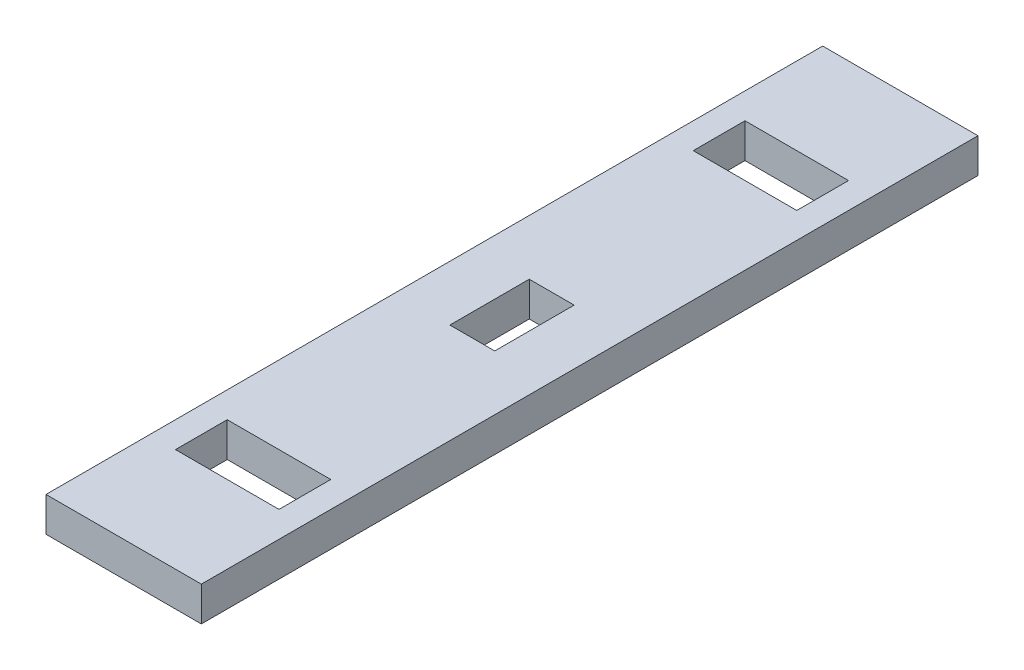
ISO-10303-21;
HEADER;
FILE_DESCRIPTION(('STEP AP214'),'2;1');
FILE_NAME('part.step','',(''),(''),'','','');
FILE_SCHEMA(('AUTOMOTIVE_DESIGN { 1 0 10303 214 1 1 1 1 }'));
ENDSEC;
DATA;
#1=APPLICATION_CONTEXT('core data for automotive mechanical design processes');
#2=APPLICATION_PROTOCOL_DEFINITION('international standard','automotive_design',2000,#1);
#3=PRODUCT_CONTEXT('',#1,'mechanical');
#4=PRODUCT('Part','Part','',(#3));
#5=PRODUCT_RELATED_PRODUCT_CATEGORY('part','',(#4));
#6=PRODUCT_DEFINITION_FORMATION('','',#4);
#7=PRODUCT_DEFINITION_CONTEXT('part definition',#1,'design');
#8=PRODUCT_DEFINITION('design','',#6,#7);
#9=PRODUCT_DEFINITION_SHAPE('','',#8);
#10=(LENGTH_UNIT() NAMED_UNIT(*) SI_UNIT(.MILLI.,.METRE.));
#11=(NAMED_UNIT(*) PLANE_ANGLE_UNIT() SI_UNIT($,.RADIAN.));
#12=(NAMED_UNIT(*) SI_UNIT($,.STERADIAN.) SOLID_ANGLE_UNIT());
#13=UNCERTAINTY_MEASURE_WITH_UNIT(LENGTH_MEASURE(1.E-05),#10,'distance_accuracy_value','');
#14=(GEOMETRIC_REPRESENTATION_CONTEXT(3) GLOBAL_UNCERTAINTY_ASSIGNED_CONTEXT((#13)) GLOBAL_UNIT_ASSIGNED_CONTEXT((#10,
#11,#12)) REPRESENTATION_CONTEXT('',''));
#15=CARTESIAN_POINT('',(0.,0.,0.));
#16=DIRECTION('',(0.,0.,1.));
#17=DIRECTION('',(1.,0.,0.));
#18=AXIS2_PLACEMENT_3D('',#15,#16,#17);
#19=CARTESIAN_POINT('',(7.90898213590071,2.,0.));
#20=DIRECTION('',(1.,0.,0.));
#21=DIRECTION('',(0.,0.,-1.));
#22=AXIS2_PLACEMENT_3D('',#19,#20,#21);
#23=PLANE('',#22);
#24=DIRECTION('',(0.,0.,1.));
#25=VECTOR('',#24,1.);
#26=CARTESIAN_POINT('',(7.90898213590071,0.,0.));
#27=LINE('',#26,#25);
#28=CARTESIAN_POINT('',(7.90898213590072,0.,-43.1225165562914));
#29=VERTEX_POINT('',#28);
#30=CARTESIAN_POINT('',(7.90898213590071,0.,1.87748344370861));
#31=VERTEX_POINT('',#30);
#32=EDGE_CURVE('E241',#29,#31,#27,.T.);
#33=ORIENTED_EDGE('',*,*,#32,.F.);
#34=DIRECTION('',(0.,-1.,0.));
#35=VECTOR('',#34,1.);
#36=CARTESIAN_POINT('',(7.90898213590072,2.,-43.1225165562914));
#37=LINE('',#36,#35);
#38=CARTESIAN_POINT('',(7.90898213590072,2.,-43.1225165562914));
#39=VERTEX_POINT('',#38);
#40=EDGE_CURVE('E260',#39,#29,#37,.T.);
#41=ORIENTED_EDGE('',*,*,#40,.F.);
#42=DIRECTION('',(0.,0.,1.));
#43=VECTOR('',#42,1.);
#44=CARTESIAN_POINT('',(7.90898213590071,2.,0.));
#45=LINE('',#44,#43);
#46=CARTESIAN_POINT('',(7.90898213590071,2.,1.87748344370861));
#47=VERTEX_POINT('',#46);
#48=EDGE_CURVE('E207',#39,#47,#45,.T.);
#49=ORIENTED_EDGE('',*,*,#48,.T.);
#50=DIRECTION('',(0.,-1.,0.));
#51=VECTOR('',#50,1.);
#52=CARTESIAN_POINT('',(7.90898213590071,2.,1.87748344370861));
#53=LINE('',#52,#51);
#54=EDGE_CURVE('E252',#47,#31,#53,.T.);
#55=ORIENTED_EDGE('',*,*,#54,.T.);
#56=EDGE_LOOP('',(#33,#41,#49,#55));
#57=FACE_BOUND('',#56,.T.);
#58=ADVANCED_FACE('F44',(#57),#23,.T.);
#59=CARTESIAN_POINT('',(0.,2.,-43.1225165562914));
#60=DIRECTION('',(0.,0.,-1.));
#61=DIRECTION('',(-1.,0.,0.));
#62=AXIS2_PLACEMENT_3D('',#59,#60,#61);
#63=PLANE('',#62);
#64=DIRECTION('',(1.,0.,0.));
#65=VECTOR('',#64,1.);
#66=CARTESIAN_POINT('',(0.,0.,-43.1225165562914));
#67=LINE('',#66,#65);
#68=CARTESIAN_POINT('',(-1.09101786409928,0.,-43.1225165562914));
#69=VERTEX_POINT('',#68);
#70=EDGE_CURVE('E244',#69,#29,#67,.T.);
#71=ORIENTED_EDGE('',*,*,#70,.F.);
#72=DIRECTION('',(0.,-1.,0.));
#73=VECTOR('',#72,1.);
#74=CARTESIAN_POINT('',(-1.09101786409928,2.,-43.1225165562914));
#75=LINE('',#74,#73);
#76=CARTESIAN_POINT('',(-1.09101786409928,2.,-43.1225165562914));
#77=VERTEX_POINT('',#76);
#78=EDGE_CURVE('E258',#77,#69,#75,.T.);
#79=ORIENTED_EDGE('',*,*,#78,.F.);
#80=DIRECTION('',(1.,0.,0.));
#81=VECTOR('',#80,1.);
#82=CARTESIAN_POINT('',(0.,2.,-43.1225165562914));
#83=LINE('',#82,#81);
#84=EDGE_CURVE('E210',#77,#39,#83,.T.);
#85=ORIENTED_EDGE('',*,*,#84,.T.);
#86=ORIENTED_EDGE('',*,*,#40,.T.);
#87=EDGE_LOOP('',(#71,#79,#85,#86));
#88=FACE_BOUND('',#87,.T.);
#89=ADVANCED_FACE('F296',(#88),#63,.T.);
#90=CARTESIAN_POINT('',(-1.09101786409928,2.,0.));
#91=DIRECTION('',(1.,0.,0.));
#92=DIRECTION('',(0.,0.,-1.));
#93=AXIS2_PLACEMENT_3D('',#90,#91,#92);
#94=PLANE('',#93);
#95=DIRECTION('',(0.,0.,1.));
#96=VECTOR('',#95,1.);
#97=CARTESIAN_POINT('',(-1.09101786409928,0.,0.));
#98=LINE('',#97,#96);
#99=CARTESIAN_POINT('',(-1.09101786409928,0.,1.87748344370861));
#100=VERTEX_POINT('',#99);
#101=EDGE_CURVE('E247',#69,#100,#98,.T.);
#102=ORIENTED_EDGE('',*,*,#101,.T.);
#103=DIRECTION('',(0.,-1.,0.));
#104=VECTOR('',#103,1.);
#105=CARTESIAN_POINT('',(-1.09101786409928,2.,1.87748344370861));
#106=LINE('',#105,#104);
#107=CARTESIAN_POINT('',(-1.09101786409928,2.,1.87748344370861));
#108=VERTEX_POINT('',#107);
#109=EDGE_CURVE('E254',#108,#100,#106,.T.);
#110=ORIENTED_EDGE('',*,*,#109,.F.);
#111=DIRECTION('',(0.,0.,1.));
#112=VECTOR('',#111,1.);
#113=CARTESIAN_POINT('',(-1.09101786409928,2.,0.));
#114=LINE('',#113,#112);
#115=EDGE_CURVE('E213',#77,#108,#114,.T.);
#116=ORIENTED_EDGE('',*,*,#115,.F.);
#117=ORIENTED_EDGE('',*,*,#78,.T.);
#118=EDGE_LOOP('',(#102,#110,#116,#117));
#119=FACE_BOUND('',#118,.T.);
#120=ADVANCED_FACE('F302',(#119),#94,.F.);
#121=CARTESIAN_POINT('',(6.40898213590072,2.,0.));
#122=DIRECTION('',(-1.,0.,0.));
#123=DIRECTION('',(0.,0.,1.));
#124=AXIS2_PLACEMENT_3D('',#121,#122,#123);
#125=PLANE('',#124);
#126=DIRECTION('',(0.,0.,-1.));
#127=VECTOR('',#126,1.);
#128=CARTESIAN_POINT('',(6.40898213590072,0.,0.));
#129=LINE('',#128,#127);
#130=CARTESIAN_POINT('',(6.40898213590072,0.,-4.12251655629139));
#131=VERTEX_POINT('',#130);
#132=CARTESIAN_POINT('',(6.40898213590072,0.,-7.12251655629139));
#133=VERTEX_POINT('',#132);
#134=EDGE_CURVE('E229',#131,#133,#129,.T.);
#135=ORIENTED_EDGE('',*,*,#134,.F.);
#136=DIRECTION('',(0.,-1.,0.));
#137=VECTOR('',#136,1.);
#138=CARTESIAN_POINT('',(6.40898213590072,2.,-4.12251655629139));
#139=LINE('',#138,#137);
#140=CARTESIAN_POINT('',(6.40898213590072,2.,-4.12251655629139));
#141=VERTEX_POINT('',#140);
#142=EDGE_CURVE('E255',#141,#131,#139,.T.);
#143=ORIENTED_EDGE('',*,*,#142,.F.);
#144=DIRECTION('',(0.,0.,-1.));
#145=VECTOR('',#144,1.);
#146=CARTESIAN_POINT('',(6.40898213590072,2.,0.));
#147=LINE('',#146,#145);
#148=CARTESIAN_POINT('',(6.40898213590072,2.,-7.12251655629139));
#149=VERTEX_POINT('',#148);
#150=EDGE_CURVE('E196',#141,#149,#147,.T.);
#151=ORIENTED_EDGE('',*,*,#150,.T.);
#152=DIRECTION('',(0.,-1.,0.));
#153=VECTOR('',#152,1.);
#154=CARTESIAN_POINT('',(6.40898213590072,2.,-7.12251655629139));
#155=LINE('',#154,#153);
#156=EDGE_CURVE('E263',#149,#133,#155,.T.);
#157=ORIENTED_EDGE('',*,*,#156,.T.);
#158=EDGE_LOOP('',(#135,#143,#151,#157));
#159=FACE_BOUND('',#158,.T.);
#160=ADVANCED_FACE('F321',(#159),#125,.T.);
#161=CARTESIAN_POINT('',(0.,2.,-4.12251655629139));
#162=DIRECTION('',(0.,0.,-1.));
#163=DIRECTION('',(-1.,0.,0.));
#164=AXIS2_PLACEMENT_3D('',#161,#162,#163);
#165=PLANE('',#164);
#166=DIRECTION('',(1.,0.,0.));
#167=VECTOR('',#166,1.);
#168=CARTESIAN_POINT('',(0.,0.,-4.12251655629139));
#169=LINE('',#168,#167);
#170=CARTESIAN_POINT('',(0.408982135900718,0.,-4.12251655629139));
#171=VERTEX_POINT('',#170);
#172=EDGE_CURVE('E232',#171,#131,#169,.T.);
#173=ORIENTED_EDGE('',*,*,#172,.F.);
#174=DIRECTION('',(0.,-1.,0.));
#175=VECTOR('',#174,1.);
#176=CARTESIAN_POINT('',(0.408982135900718,2.,-4.12251655629139));
#177=LINE('',#176,#175);
#178=CARTESIAN_POINT('',(0.408982135900718,2.,-4.12251655629139));
#179=VERTEX_POINT('',#178);
#180=EDGE_CURVE('E269',#179,#171,#177,.T.);
#181=ORIENTED_EDGE('',*,*,#180,.F.);
#182=DIRECTION('',(1.,0.,0.));
#183=VECTOR('',#182,1.);
#184=CARTESIAN_POINT('',(0.,2.,-4.12251655629139));
#185=LINE('',#184,#183);
#186=EDGE_CURVE('E199',#179,#141,#185,.T.);
#187=ORIENTED_EDGE('',*,*,#186,.T.);
#188=ORIENTED_EDGE('',*,*,#142,.T.);
#189=EDGE_LOOP('',(#173,#181,#187,#188));
#190=FACE_BOUND('',#189,.T.);
#191=ADVANCED_FACE('F317',(#190),#165,.T.);
#192=CARTESIAN_POINT('',(0.408982135900717,2.,0.));
#193=DIRECTION('',(-1.,0.,0.));
#194=DIRECTION('',(0.,0.,1.));
#195=AXIS2_PLACEMENT_3D('',#192,#193,#194);
#196=PLANE('',#195);
#197=DIRECTION('',(0.,0.,-1.));
#198=VECTOR('',#197,1.);
#199=CARTESIAN_POINT('',(0.408982135900717,0.,0.));
#200=LINE('',#199,#198);
#201=CARTESIAN_POINT('',(0.408982135900719,0.,-7.12251655629139));
#202=VERTEX_POINT('',#201);
#203=EDGE_CURVE('E235',#171,#202,#200,.T.);
#204=ORIENTED_EDGE('',*,*,#203,.T.);
#205=DIRECTION('',(0.,-1.,0.));
#206=VECTOR('',#205,1.);
#207=CARTESIAN_POINT('',(0.408982135900719,2.,-7.12251655629139));
#208=LINE('',#207,#206);
#209=CARTESIAN_POINT('',(0.408982135900719,2.,-7.12251655629139));
#210=VERTEX_POINT('',#209);
#211=EDGE_CURVE('E265',#210,#202,#208,.T.);
#212=ORIENTED_EDGE('',*,*,#211,.F.);
#213=DIRECTION('',(0.,0.,-1.));
#214=VECTOR('',#213,1.);
#215=CARTESIAN_POINT('',(0.408982135900717,2.,0.));
#216=LINE('',#215,#214);
#217=EDGE_CURVE('E202',#179,#210,#216,.T.);
#218=ORIENTED_EDGE('',*,*,#217,.F.);
#219=ORIENTED_EDGE('',*,*,#180,.T.);
#220=EDGE_LOOP('',(#204,#212,#218,#219));
#221=FACE_BOUND('',#220,.T.);
#222=ADVANCED_FACE('F314',(#221),#196,.F.);
#223=CARTESIAN_POINT('',(0.408982135900721,2.,0.));
#224=DIRECTION('',(1.,0.,0.));
#225=DIRECTION('',(0.,0.,-1.));
#226=AXIS2_PLACEMENT_3D('',#223,#224,#225);
#227=PLANE('',#226);
#228=DIRECTION('',(0.,0.,1.));
#229=VECTOR('',#228,1.);
#230=CARTESIAN_POINT('',(0.408982135900721,0.,0.));
#231=LINE('',#230,#229);
#232=CARTESIAN_POINT('',(0.408982135900721,0.,-37.1225165562914));
#233=VERTEX_POINT('',#232);
#234=CARTESIAN_POINT('',(0.408982135900721,0.,-34.1225165562914));
#235=VERTEX_POINT('',#234);
#236=EDGE_CURVE('E161',#233,#235,#231,.T.);
#237=ORIENTED_EDGE('',*,*,#236,.F.);
#238=DIRECTION('',(0.,-1.,0.));
#239=VECTOR('',#238,1.);
#240=CARTESIAN_POINT('',(0.408982135900721,2.,-37.1225165562914));
#241=LINE('',#240,#239);
#242=CARTESIAN_POINT('',(0.408982135900721,2.,-37.1225165562914));
#243=VERTEX_POINT('',#242);
#244=EDGE_CURVE('E266',#243,#233,#241,.T.);
#245=ORIENTED_EDGE('',*,*,#244,.F.);
#246=DIRECTION('',(0.,0.,1.));
#247=VECTOR('',#246,1.);
#248=CARTESIAN_POINT('',(0.408982135900721,2.,0.));
#249=LINE('',#248,#247);
#250=CARTESIAN_POINT('',(0.408982135900721,2.,-34.1225165562914));
#251=VERTEX_POINT('',#250);
#252=EDGE_CURVE('E185',#243,#251,#249,.T.);
#253=ORIENTED_EDGE('',*,*,#252,.T.);
#254=DIRECTION('',(0.,-1.,0.));
#255=VECTOR('',#254,1.);
#256=CARTESIAN_POINT('',(0.408982135900721,2.,-34.1225165562914));
#257=LINE('',#256,#255);
#258=EDGE_CURVE('E218',#251,#235,#257,.T.);
#259=ORIENTED_EDGE('',*,*,#258,.T.);
#260=EDGE_LOOP('',(#237,#245,#253,#259));
#261=FACE_BOUND('',#260,.T.);
#262=ADVANCED_FACE('F46',(#261),#227,.T.);
#263=CARTESIAN_POINT('',(0.,2.,-37.1225165562914));
#264=DIRECTION('',(0.,0.,-1.));
#265=DIRECTION('',(-1.,0.,0.));
#266=AXIS2_PLACEMENT_3D('',#263,#264,#265);
#267=PLANE('',#266);
#268=DIRECTION('',(1.,0.,0.));
#269=VECTOR('',#268,1.);
#270=CARTESIAN_POINT('',(0.,0.,-37.1225165562914));
#271=LINE('',#270,#269);
#272=CARTESIAN_POINT('',(6.40898213590072,0.,-37.1225165562914));
#273=VERTEX_POINT('',#272);
#274=EDGE_CURVE('E221',#233,#273,#271,.T.);
#275=ORIENTED_EDGE('',*,*,#274,.T.);
#276=DIRECTION('',(0.,-1.,0.));
#277=VECTOR('',#276,1.);
#278=CARTESIAN_POINT('',(6.40898213590072,2.,-37.1225165562914));
#279=LINE('',#278,#277);
#280=CARTESIAN_POINT('',(6.40898213590072,2.,-37.1225165562914));
#281=VERTEX_POINT('',#280);
#282=EDGE_CURVE('E275',#281,#273,#279,.T.);
#283=ORIENTED_EDGE('',*,*,#282,.F.);
#284=DIRECTION('',(1.,0.,0.));
#285=VECTOR('',#284,1.);
#286=CARTESIAN_POINT('',(0.,2.,-37.1225165562914));
#287=LINE('',#286,#285);
#288=EDGE_CURVE('E188',#243,#281,#287,.T.);
#289=ORIENTED_EDGE('',*,*,#288,.F.);
#290=ORIENTED_EDGE('',*,*,#244,.T.);
#291=EDGE_LOOP('',(#275,#283,#289,#290));
#292=FACE_BOUND('',#291,.T.);
#293=ADVANCED_FACE('F331',(#292),#267,.F.);
#294=CARTESIAN_POINT('',(6.40898213590072,2.,0.));
#295=DIRECTION('',(1.,0.,0.));
#296=DIRECTION('',(0.,0.,-1.));
#297=AXIS2_PLACEMENT_3D('',#294,#295,#296);
#298=PLANE('',#297);
#299=DIRECTION('',(0.,0.,1.));
#300=VECTOR('',#299,1.);
#301=CARTESIAN_POINT('',(6.40898213590072,0.,0.));
#302=LINE('',#301,#300);
#303=CARTESIAN_POINT('',(6.40898213590072,0.,-34.1225165562914));
#304=VERTEX_POINT('',#303);
#305=EDGE_CURVE('E223',#273,#304,#302,.T.);
#306=ORIENTED_EDGE('',*,*,#305,.T.);
#307=DIRECTION('',(0.,-1.,0.));
#308=VECTOR('',#307,1.);
#309=CARTESIAN_POINT('',(6.40898213590072,2.,-34.1225165562914));
#310=LINE('',#309,#308);
#311=CARTESIAN_POINT('',(6.40898213590072,2.,-34.1225165562914));
#312=VERTEX_POINT('',#311);
#313=EDGE_CURVE('E273',#312,#304,#310,.T.);
#314=ORIENTED_EDGE('',*,*,#313,.F.);
#315=DIRECTION('',(0.,0.,1.));
#316=VECTOR('',#315,1.);
#317=CARTESIAN_POINT('',(6.40898213590072,2.,0.));
#318=LINE('',#317,#316);
#319=EDGE_CURVE('E191',#281,#312,#318,.T.);
#320=ORIENTED_EDGE('',*,*,#319,.F.);
#321=ORIENTED_EDGE('',*,*,#282,.T.);
#322=EDGE_LOOP('',(#306,#314,#320,#321));
#323=FACE_BOUND('',#322,.T.);
#324=ADVANCED_FACE('F312',(#323),#298,.F.);
#325=CARTESIAN_POINT('',(0.,2.,-7.12251655629139));
#326=DIRECTION('',(0.,0.,-1.));
#327=DIRECTION('',(-1.,0.,0.));
#328=AXIS2_PLACEMENT_3D('',#325,#326,#327);
#329=PLANE('',#328);
#330=DIRECTION('',(1.,0.,0.));
#331=VECTOR('',#330,1.);
#332=CARTESIAN_POINT('',(0.,0.,-7.12251655629139));
#333=LINE('',#332,#331);
#334=EDGE_CURVE('E238',#202,#133,#333,.T.);
#335=ORIENTED_EDGE('',*,*,#334,.T.);
#336=ORIENTED_EDGE('',*,*,#156,.F.);
#337=DIRECTION('',(1.,0.,0.));
#338=VECTOR('',#337,1.);
#339=CARTESIAN_POINT('',(0.,2.,-7.12251655629139));
#340=LINE('',#339,#338);
#341=EDGE_CURVE('E205',#210,#149,#340,.T.);
#342=ORIENTED_EDGE('',*,*,#341,.F.);
#343=ORIENTED_EDGE('',*,*,#211,.T.);
#344=EDGE_LOOP('',(#335,#336,#342,#343));
#345=FACE_BOUND('',#344,.T.);
#346=ADVANCED_FACE('F308',(#345),#329,.F.);
#347=CARTESIAN_POINT('',(0.,2.,-34.1225165562914));
#348=DIRECTION('',(0.,0.,-1.));
#349=DIRECTION('',(-1.,0.,0.));
#350=AXIS2_PLACEMENT_3D('',#347,#348,#349);
#351=PLANE('',#350);
#352=DIRECTION('',(1.,0.,0.));
#353=VECTOR('',#352,1.);
#354=CARTESIAN_POINT('',(0.,0.,-34.1225165562914));
#355=LINE('',#354,#353);
#356=EDGE_CURVE('E226',#235,#304,#355,.T.);
#357=ORIENTED_EDGE('',*,*,#356,.F.);
#358=ORIENTED_EDGE('',*,*,#258,.F.);
#359=DIRECTION('',(1.,0.,0.));
#360=VECTOR('',#359,1.);
#361=CARTESIAN_POINT('',(0.,2.,-34.1225165562914));
#362=LINE('',#361,#360);
#363=EDGE_CURVE('E193',#251,#312,#362,.T.);
#364=ORIENTED_EDGE('',*,*,#363,.T.);
#365=ORIENTED_EDGE('',*,*,#313,.T.);
#366=EDGE_LOOP('',(#357,#358,#364,#365));
#367=FACE_BOUND('',#366,.T.);
#368=ADVANCED_FACE('F311',(#367),#351,.T.);
#369=CARTESIAN_POINT('',(0.,2.,1.87748344370861));
#370=DIRECTION('',(0.,0.,-1.));
#371=DIRECTION('',(-1.,0.,0.));
#372=AXIS2_PLACEMENT_3D('',#369,#370,#371);
#373=PLANE('',#372);
#374=DIRECTION('',(1.,0.,0.));
#375=VECTOR('',#374,1.);
#376=CARTESIAN_POINT('',(0.,0.,1.87748344370861));
#377=LINE('',#376,#375);
#378=EDGE_CURVE('E189',#100,#31,#377,.T.);
#379=ORIENTED_EDGE('',*,*,#378,.T.);
#380=ORIENTED_EDGE('',*,*,#54,.F.);
#381=DIRECTION('',(1.,0.,0.));
#382=VECTOR('',#381,1.);
#383=CARTESIAN_POINT('',(0.,2.,1.87748344370861));
#384=LINE('',#383,#382);
#385=EDGE_CURVE('E216',#108,#47,#384,.T.);
#386=ORIENTED_EDGE('',*,*,#385,.F.);
#387=ORIENTED_EDGE('',*,*,#109,.T.);
#388=EDGE_LOOP('',(#379,#380,#386,#387));
#389=FACE_BOUND('',#388,.T.);
#390=ADVANCED_FACE('F328',(#389),#373,.F.);
#391=CARTESIAN_POINT('',(0.,2.,0.));
#392=DIRECTION('',(0.,1.,0.));
#393=DIRECTION('',(0.,0.,1.));
#394=AXIS2_PLACEMENT_3D('',#391,#392,#393);
#395=PLANE('',#394);
#396=DIRECTION('',(0.,0.,1.));
#397=VECTOR('',#396,1.);
#398=CARTESIAN_POINT('',(2.10898213590072,2.,0.));
#399=LINE('',#398,#397);
#400=CARTESIAN_POINT('',(2.10898213590072,2.,-22.9225165562914));
#401=VERTEX_POINT('',#400);
#402=CARTESIAN_POINT('',(2.10898213590072,2.,-18.3225165562914));
#403=VERTEX_POINT('',#402);
#404=EDGE_CURVE('E59',#401,#403,#399,.T.);
#405=ORIENTED_EDGE('',*,*,#404,.F.);
#406=DIRECTION('',(-1.,0.,0.));
#407=VECTOR('',#406,1.);
#408=CARTESIAN_POINT('',(0.,2.,-22.9225165562914));
#409=LINE('',#408,#407);
#410=CARTESIAN_POINT('',(4.70898213590072,2.,-22.9225165562914));
#411=VERTEX_POINT('',#410);
#412=EDGE_CURVE('E165',#411,#401,#409,.T.);
#413=ORIENTED_EDGE('',*,*,#412,.F.);
#414=DIRECTION('',(0.,0.,1.));
#415=VECTOR('',#414,1.);
#416=CARTESIAN_POINT('',(4.70898213590071,2.,0.));
#417=LINE('',#416,#415);
#418=CARTESIAN_POINT('',(4.70898213590072,2.,-18.3225165562914));
#419=VERTEX_POINT('',#418);
#420=EDGE_CURVE('E171',#411,#419,#417,.T.);
#421=ORIENTED_EDGE('',*,*,#420,.T.);
#422=DIRECTION('',(-1.,0.,0.));
#423=VECTOR('',#422,1.);
#424=CARTESIAN_POINT('',(0.,2.,-18.3225165562914));
#425=LINE('',#424,#423);
#426=EDGE_CURVE('E176',#419,#403,#425,.T.);
#427=ORIENTED_EDGE('',*,*,#426,.T.);
#428=EDGE_LOOP('',(#405,#413,#421,#427));
#429=FACE_BOUND('',#428,.T.);
#430=ORIENTED_EDGE('',*,*,#252,.F.);
#431=ORIENTED_EDGE('',*,*,#288,.T.);
#432=ORIENTED_EDGE('',*,*,#319,.T.);
#433=ORIENTED_EDGE('',*,*,#363,.F.);
#434=EDGE_LOOP('',(#430,#431,#432,#433));
#435=FACE_BOUND('',#434,.T.);
#436=ORIENTED_EDGE('',*,*,#150,.F.);
#437=ORIENTED_EDGE('',*,*,#186,.F.);
#438=ORIENTED_EDGE('',*,*,#217,.T.);
#439=ORIENTED_EDGE('',*,*,#341,.T.);
#440=EDGE_LOOP('',(#436,#437,#438,#439));
#441=FACE_BOUND('',#440,.T.);
#442=ORIENTED_EDGE('',*,*,#48,.F.);
#443=ORIENTED_EDGE('',*,*,#84,.F.);
#444=ORIENTED_EDGE('',*,*,#115,.T.);
#445=ORIENTED_EDGE('',*,*,#385,.T.);
#446=EDGE_LOOP('',(#442,#443,#444,#445));
#447=FACE_BOUND('',#446,.T.);
#448=ADVANCED_FACE('F174',(#429,#435,#441,#447),#395,.T.);
#449=CARTESIAN_POINT('',(0.,0.,0.));
#450=DIRECTION('',(0.,1.,0.));
#451=DIRECTION('',(0.,0.,1.));
#452=AXIS2_PLACEMENT_3D('',#449,#450,#451);
#453=PLANE('',#452);
#454=DIRECTION('',(-1.,0.,0.));
#455=VECTOR('',#454,1.);
#456=CARTESIAN_POINT('',(0.,0.,-22.9225165562914));
#457=LINE('',#456,#455);
#458=CARTESIAN_POINT('',(4.70898213590072,0.,-22.9225165562914));
#459=VERTEX_POINT('',#458);
#460=CARTESIAN_POINT('',(2.10898213590072,0.,-22.9225165562914));
#461=VERTEX_POINT('',#460);
#462=EDGE_CURVE('E52',#459,#461,#457,.T.);
#463=ORIENTED_EDGE('',*,*,#462,.T.);
#464=DIRECTION('',(0.,0.,1.));
#465=VECTOR('',#464,1.);
#466=CARTESIAN_POINT('',(2.10898213590072,0.,0.));
#467=LINE('',#466,#465);
#468=CARTESIAN_POINT('',(2.10898213590072,0.,-18.3225165562914));
#469=VERTEX_POINT('',#468);
#470=EDGE_CURVE('E11',#461,#469,#467,.T.);
#471=ORIENTED_EDGE('',*,*,#470,.T.);
#472=DIRECTION('',(-1.,0.,0.));
#473=VECTOR('',#472,1.);
#474=CARTESIAN_POINT('',(0.,0.,-18.3225165562914));
#475=LINE('',#474,#473);
#476=CARTESIAN_POINT('',(4.70898213590072,0.,-18.3225165562914));
#477=VERTEX_POINT('',#476);
#478=EDGE_CURVE('E262',#477,#469,#475,.T.);
#479=ORIENTED_EDGE('',*,*,#478,.F.);
#480=DIRECTION('',(0.,0.,1.));
#481=VECTOR('',#480,1.);
#482=CARTESIAN_POINT('',(4.70898213590071,0.,0.));
#483=LINE('',#482,#481);
#484=EDGE_CURVE('E280',#459,#477,#483,.T.);
#485=ORIENTED_EDGE('',*,*,#484,.F.);
#486=EDGE_LOOP('',(#463,#471,#479,#485));
#487=FACE_BOUND('',#486,.T.);
#488=ORIENTED_EDGE('',*,*,#236,.T.);
#489=ORIENTED_EDGE('',*,*,#356,.T.);
#490=ORIENTED_EDGE('',*,*,#305,.F.);
#491=ORIENTED_EDGE('',*,*,#274,.F.);
#492=EDGE_LOOP('',(#488,#489,#490,#491));
#493=FACE_BOUND('',#492,.T.);
#494=ORIENTED_EDGE('',*,*,#134,.T.);
#495=ORIENTED_EDGE('',*,*,#334,.F.);
#496=ORIENTED_EDGE('',*,*,#203,.F.);
#497=ORIENTED_EDGE('',*,*,#172,.T.);
#498=EDGE_LOOP('',(#494,#495,#496,#497));
#499=FACE_BOUND('',#498,.T.);
#500=ORIENTED_EDGE('',*,*,#32,.T.);
#501=ORIENTED_EDGE('',*,*,#378,.F.);
#502=ORIENTED_EDGE('',*,*,#101,.F.);
#503=ORIENTED_EDGE('',*,*,#70,.T.);
#504=EDGE_LOOP('',(#500,#501,#502,#503));
#505=FACE_BOUND('',#504,.T.);
#506=ADVANCED_FACE('F283',(#487,#493,#499,#505),#453,.F.);
#507=CARTESIAN_POINT('',(2.10898213590072,-1.2E-05,0.));
#508=DIRECTION('',(-1.,0.,0.));
#509=DIRECTION('',(0.,0.,1.));
#510=AXIS2_PLACEMENT_3D('',#507,#508,#509);
#511=PLANE('',#510);
#512=DIRECTION('',(0.,1.,0.));
#513=VECTOR('',#512,1.);
#514=CARTESIAN_POINT('',(2.10898213590072,-1.2E-05,-22.9225165562914));
#515=LINE('',#514,#513);
#516=EDGE_CURVE('E156',#461,#401,#515,.T.);
#517=ORIENTED_EDGE('',*,*,#516,.T.);
#518=ORIENTED_EDGE('',*,*,#404,.T.);
#519=DIRECTION('',(0.,1.,0.));
#520=VECTOR('',#519,1.);
#521=CARTESIAN_POINT('',(2.10898213590072,-1.2E-05,-18.3225165562914));
#522=LINE('',#521,#520);
#523=EDGE_CURVE('E181',#469,#403,#522,.T.);
#524=ORIENTED_EDGE('',*,*,#523,.F.);
#525=ORIENTED_EDGE('',*,*,#470,.F.);
#526=EDGE_LOOP('',(#517,#518,#524,#525));
#527=FACE_BOUND('',#526,.T.);
#528=ADVANCED_FACE('F158',(#527),#511,.F.);
#529=CARTESIAN_POINT('',(0.,-1.2E-05,-22.9225165562914));
#530=DIRECTION('',(0.,0.,-1.));
#531=DIRECTION('',(-1.,0.,0.));
#532=AXIS2_PLACEMENT_3D('',#529,#530,#531);
#533=PLANE('',#532);
#534=DIRECTION('',(0.,1.,0.));
#535=VECTOR('',#534,1.);
#536=CARTESIAN_POINT('',(4.70898213590072,-1.2E-05,-22.9225165562914));
#537=LINE('',#536,#535);
#538=EDGE_CURVE('E162',#459,#411,#537,.T.);
#539=ORIENTED_EDGE('',*,*,#538,.T.);
#540=ORIENTED_EDGE('',*,*,#412,.T.);
#541=ORIENTED_EDGE('',*,*,#516,.F.);
#542=ORIENTED_EDGE('',*,*,#462,.F.);
#543=EDGE_LOOP('',(#539,#540,#541,#542));
#544=FACE_BOUND('',#543,.T.);
#545=ADVANCED_FACE('F166',(#544),#533,.F.);
#546=CARTESIAN_POINT('',(4.70898213590071,-1.2E-05,0.));
#547=DIRECTION('',(-1.,0.,0.));
#548=DIRECTION('',(0.,0.,1.));
#549=AXIS2_PLACEMENT_3D('',#546,#547,#548);
#550=PLANE('',#549);
#551=ORIENTED_EDGE('',*,*,#484,.T.);
#552=DIRECTION('',(0.,1.,0.));
#553=VECTOR('',#552,1.);
#554=CARTESIAN_POINT('',(4.70898213590072,-1.2E-05,-18.3225165562914));
#555=LINE('',#554,#553);
#556=EDGE_CURVE('E67',#477,#419,#555,.T.);
#557=ORIENTED_EDGE('',*,*,#556,.T.);
#558=ORIENTED_EDGE('',*,*,#420,.F.);
#559=ORIENTED_EDGE('',*,*,#538,.F.);
#560=EDGE_LOOP('',(#551,#557,#558,#559));
#561=FACE_BOUND('',#560,.T.);
#562=ADVANCED_FACE('F287',(#561),#550,.T.);
#563=CARTESIAN_POINT('',(0.,-1.2E-05,-18.3225165562914));
#564=DIRECTION('',(0.,0.,-1.));
#565=DIRECTION('',(-1.,0.,0.));
#566=AXIS2_PLACEMENT_3D('',#563,#564,#565);
#567=PLANE('',#566);
#568=ORIENTED_EDGE('',*,*,#478,.T.);
#569=ORIENTED_EDGE('',*,*,#523,.T.);
#570=ORIENTED_EDGE('',*,*,#426,.F.);
#571=ORIENTED_EDGE('',*,*,#556,.F.);
#572=EDGE_LOOP('',(#568,#569,#570,#571));
#573=FACE_BOUND('',#572,.T.);
#574=ADVANCED_FACE('F288',(#573),#567,.T.);
#575=CLOSED_SHELL('',(#58,#89,#120,#160,#191,#222,#262,#293,#324,#346,#368,#390,#448,#506,#528,
#545,#562,#574));
#576=MANIFOLD_SOLID_BREP('B2',#575);
#577=ADVANCED_BREP_SHAPE_REPRESENTATION('',(#18,#576),#14);
#578=SHAPE_DEFINITION_REPRESENTATION(#9,#577);
ENDSEC;
END-ISO-10303-21;
